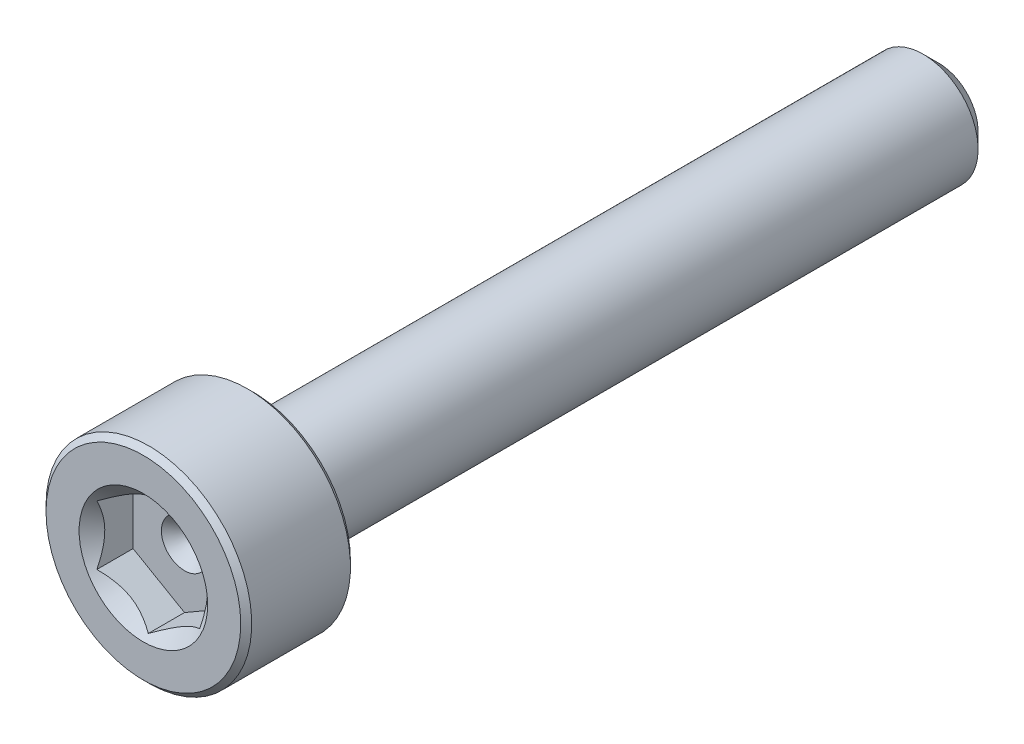
ISO-10303-21;
HEADER;
FILE_DESCRIPTION(('STEP AP214'),'2;1');
FILE_NAME('part.step','',(''),(''),'','','');
FILE_SCHEMA(('AUTOMOTIVE_DESIGN { 1 0 10303 214 1 1 1 1 }'));
ENDSEC;
DATA;
#1=APPLICATION_CONTEXT('core data for automotive mechanical design processes');
#2=APPLICATION_PROTOCOL_DEFINITION('international standard','automotive_design',2000,#1);
#3=PRODUCT_CONTEXT('',#1,'mechanical');
#4=PRODUCT('Part','Part','',(#3));
#5=PRODUCT_RELATED_PRODUCT_CATEGORY('part','',(#4));
#6=PRODUCT_DEFINITION_FORMATION('','',#4);
#7=PRODUCT_DEFINITION_CONTEXT('part definition',#1,'design');
#8=PRODUCT_DEFINITION('design','',#6,#7);
#9=PRODUCT_DEFINITION_SHAPE('','',#8);
#10=(LENGTH_UNIT() NAMED_UNIT(*) SI_UNIT(.MILLI.,.METRE.));
#11=(NAMED_UNIT(*) PLANE_ANGLE_UNIT() SI_UNIT($,.RADIAN.));
#12=(NAMED_UNIT(*) SI_UNIT($,.STERADIAN.) SOLID_ANGLE_UNIT());
#13=UNCERTAINTY_MEASURE_WITH_UNIT(LENGTH_MEASURE(1.E-05),#10,'distance_accuracy_value','');
#14=(GEOMETRIC_REPRESENTATION_CONTEXT(3) GLOBAL_UNCERTAINTY_ASSIGNED_CONTEXT((#13)) GLOBAL_UNIT_ASSIGNED_CONTEXT((#10,
#11,#12)) REPRESENTATION_CONTEXT('',''));
#15=CARTESIAN_POINT('',(0.,0.,0.));
#16=DIRECTION('',(0.,0.,1.));
#17=DIRECTION('',(1.,0.,0.));
#18=AXIS2_PLACEMENT_3D('',#15,#16,#17);
#19=CARTESIAN_POINT('',(0.,0.572668331506588,-5.8));
#20=DIRECTION('',(0.,0.,-1.));
#21=DIRECTION('',(-1.,0.,0.));
#22=AXIS2_PLACEMENT_3D('',#19,#20,#21);
#23=PLANE('',#22);
#24=CARTESIAN_POINT('',(0.,0.,-5.8));
#25=DIRECTION('',(0.,0.,-1.));
#26=DIRECTION('',(-1.,0.,0.));
#27=AXIS2_PLACEMENT_3D('',#24,#25,#26);
#28=CIRCLE('',#27,0.572668331506588);
#29=CARTESIAN_POINT('',(-0.572668331506588,0.,-5.8));
#30=VERTEX_POINT('',#29);
#31=EDGE_CURVE('E54',#30,#30,#28,.T.);
#32=ORIENTED_EDGE('',*,*,#31,.T.);
#33=EDGE_LOOP('',(#32));
#34=FACE_BOUND('',#33,.T.);
#35=ADVANCED_FACE('F41',(#34),#23,.T.);
#36=CARTESIAN_POINT('',(0.,0.,-5.8));
#37=DIRECTION('',(0.,0.,1.));
#38=DIRECTION('',(1.,0.,0.));
#39=AXIS2_PLACEMENT_3D('',#36,#37,#38);
#40=CONICAL_SURFACE('',#39,0.572668331506588,0.785398163397444);
#41=CARTESIAN_POINT('',(0.,0.,-5.57266833150659));
#42=DIRECTION('',(0.,0.,-1.));
#43=DIRECTION('',(-1.,0.,0.));
#44=AXIS2_PLACEMENT_3D('',#41,#42,#43);
#45=CIRCLE('',#44,0.8);
#46=CARTESIAN_POINT('',(-0.8,0.,-5.57266833150659));
#47=VERTEX_POINT('',#46);
#48=EDGE_CURVE('E157',#47,#47,#45,.T.);
#49=ORIENTED_EDGE('',*,*,#48,.T.);
#50=EDGE_LOOP('',(#49));
#51=FACE_BOUND('',#50,.T.);
#52=ORIENTED_EDGE('',*,*,#31,.F.);
#53=EDGE_LOOP('',(#52));
#54=FACE_BOUND('',#53,.T.);
#55=ADVANCED_FACE('F163',(#51,#54),#40,.T.);
#56=CARTESIAN_POINT('',(0.,0.,-5.8));
#57=DIRECTION('',(0.,0.,-1.));
#58=DIRECTION('',(-1.,0.,0.));
#59=AXIS2_PLACEMENT_3D('',#56,#57,#58);
#60=CYLINDRICAL_SURFACE('',#59,0.8);
#61=CARTESIAN_POINT('',(0.,0.,4.));
#62=DIRECTION('',(0.,0.,-1.));
#63=DIRECTION('',(-1.,0.,0.));
#64=AXIS2_PLACEMENT_3D('',#61,#62,#63);
#65=CIRCLE('',#64,0.800000000000001);
#66=CARTESIAN_POINT('',(-0.800000000000001,0.,4.));
#67=VERTEX_POINT('',#66);
#68=EDGE_CURVE('E154',#67,#67,#65,.T.);
#69=ORIENTED_EDGE('',*,*,#68,.T.);
#70=EDGE_LOOP('',(#69));
#71=FACE_BOUND('',#70,.T.);
#72=ORIENTED_EDGE('',*,*,#48,.F.);
#73=EDGE_LOOP('',(#72));
#74=FACE_BOUND('',#73,.T.);
#75=ADVANCED_FACE('F165',(#71,#74),#60,.T.);
#76=CARTESIAN_POINT('',(0.,0.,4.));
#77=DIRECTION('',(0.,0.,-1.));
#78=DIRECTION('',(-1.,0.,0.));
#79=AXIS2_PLACEMENT_3D('',#76,#77,#78);
#80=TOROIDAL_SURFACE('',#79,1.,0.2);
#81=CARTESIAN_POINT('',(0.,0.,4.2));
#82=DIRECTION('',(0.,0.,-1.));
#83=DIRECTION('',(-1.,0.,0.));
#84=AXIS2_PLACEMENT_3D('',#81,#82,#83);
#85=CIRCLE('',#84,1.);
#86=CARTESIAN_POINT('',(-1.,0.,4.2));
#87=VERTEX_POINT('',#86);
#88=EDGE_CURVE('E151',#87,#87,#85,.T.);
#89=ORIENTED_EDGE('',*,*,#88,.T.);
#90=EDGE_LOOP('',(#89));
#91=FACE_BOUND('',#90,.T.);
#92=ORIENTED_EDGE('',*,*,#68,.F.);
#93=EDGE_LOOP('',(#92));
#94=FACE_BOUND('',#93,.T.);
#95=ADVANCED_FACE('F171',(#91,#94),#80,.F.);
#96=CARTESIAN_POINT('',(0.,1.42,4.2));
#97=DIRECTION('',(0.,0.,-1.));
#98=DIRECTION('',(-1.,0.,0.));
#99=AXIS2_PLACEMENT_3D('',#96,#97,#98);
#100=PLANE('',#99);
#101=CARTESIAN_POINT('',(0.,0.,4.2));
#102=DIRECTION('',(0.,0.,-1.));
#103=DIRECTION('',(-1.,0.,0.));
#104=AXIS2_PLACEMENT_3D('',#101,#102,#103);
#105=CIRCLE('',#104,1.42);
#106=CARTESIAN_POINT('',(-1.42,0.,4.2));
#107=VERTEX_POINT('',#106);
#108=EDGE_CURVE('E148',#107,#107,#105,.T.);
#109=ORIENTED_EDGE('',*,*,#108,.T.);
#110=EDGE_LOOP('',(#109));
#111=FACE_BOUND('',#110,.T.);
#112=ORIENTED_EDGE('',*,*,#88,.F.);
#113=EDGE_LOOP('',(#112));
#114=FACE_BOUND('',#113,.T.);
#115=ADVANCED_FACE('F177',(#111,#114),#100,.T.);
#116=CARTESIAN_POINT('',(0.,0.,4.2));
#117=DIRECTION('',(0.,0.,1.));
#118=DIRECTION('',(1.,0.,0.));
#119=AXIS2_PLACEMENT_3D('',#116,#117,#118);
#120=CONICAL_SURFACE('',#119,1.42,0.785398163397447);
#121=CARTESIAN_POINT('',(0.,0.,4.28));
#122=DIRECTION('',(0.,0.,-1.));
#123=DIRECTION('',(-1.,0.,0.));
#124=AXIS2_PLACEMENT_3D('',#121,#122,#123);
#125=CIRCLE('',#124,1.5);
#126=CARTESIAN_POINT('',(-1.5,0.,4.28));
#127=VERTEX_POINT('',#126);
#128=EDGE_CURVE('E145',#127,#127,#125,.T.);
#129=ORIENTED_EDGE('',*,*,#128,.T.);
#130=EDGE_LOOP('',(#129));
#131=FACE_BOUND('',#130,.T.);
#132=ORIENTED_EDGE('',*,*,#108,.F.);
#133=EDGE_LOOP('',(#132));
#134=FACE_BOUND('',#133,.T.);
#135=ADVANCED_FACE('F181',(#131,#134),#120,.T.);
#136=CARTESIAN_POINT('',(0.,0.,-5.8));
#137=DIRECTION('',(0.,0.,-1.));
#138=DIRECTION('',(-1.,0.,0.));
#139=AXIS2_PLACEMENT_3D('',#136,#137,#138);
#140=CYLINDRICAL_SURFACE('',#139,1.5);
#141=CARTESIAN_POINT('',(0.,0.,5.72));
#142=DIRECTION('',(0.,0.,-1.));
#143=DIRECTION('',(-1.,0.,0.));
#144=AXIS2_PLACEMENT_3D('',#141,#142,#143);
#145=CIRCLE('',#144,1.5);
#146=CARTESIAN_POINT('',(-1.5,0.,5.72));
#147=VERTEX_POINT('',#146);
#148=EDGE_CURVE('E142',#147,#147,#145,.T.);
#149=ORIENTED_EDGE('',*,*,#148,.T.);
#150=EDGE_LOOP('',(#149));
#151=FACE_BOUND('',#150,.T.);
#152=ORIENTED_EDGE('',*,*,#128,.F.);
#153=EDGE_LOOP('',(#152));
#154=FACE_BOUND('',#153,.T.);
#155=ADVANCED_FACE('F185',(#151,#154),#140,.T.);
#156=CARTESIAN_POINT('',(0.,0.,5.72));
#157=DIRECTION('',(0.,0.,-1.));
#158=DIRECTION('',(-1.,0.,0.));
#159=AXIS2_PLACEMENT_3D('',#156,#157,#158);
#160=CONICAL_SURFACE('',#159,1.5,0.785398163397447);
#161=CARTESIAN_POINT('',(0.,0.,5.8));
#162=DIRECTION('',(0.,0.,-1.));
#163=DIRECTION('',(-1.,0.,0.));
#164=AXIS2_PLACEMENT_3D('',#161,#162,#163);
#165=CIRCLE('',#164,1.42);
#166=CARTESIAN_POINT('',(-1.42,0.,5.8));
#167=VERTEX_POINT('',#166);
#168=EDGE_CURVE('E139',#167,#167,#165,.T.);
#169=ORIENTED_EDGE('',*,*,#168,.T.);
#170=EDGE_LOOP('',(#169));
#171=FACE_BOUND('',#170,.T.);
#172=ORIENTED_EDGE('',*,*,#148,.F.);
#173=EDGE_LOOP('',(#172));
#174=FACE_BOUND('',#173,.T.);
#175=ADVANCED_FACE('F189',(#171,#174),#160,.T.);
#176=CARTESIAN_POINT('',(0.,0.,5.8));
#177=DIRECTION('',(0.,0.,1.));
#178=DIRECTION('',(1.,0.,0.));
#179=AXIS2_PLACEMENT_3D('',#176,#177,#178);
#180=PLANE('',#179);
#181=CARTESIAN_POINT('',(0.,0.,5.8));
#182=DIRECTION('',(0.,0.,1.));
#183=DIRECTION('',(1.,0.,0.));
#184=AXIS2_PLACEMENT_3D('',#181,#182,#183);
#185=CIRCLE('',#184,0.9375);
#186=CARTESIAN_POINT('',(0.9375,0.,5.8));
#187=VERTEX_POINT('',#186);
#188=EDGE_CURVE('E275',#187,#187,#185,.T.);
#189=ORIENTED_EDGE('',*,*,#188,.F.);
#190=EDGE_LOOP('',(#189));
#191=FACE_BOUND('',#190,.T.);
#192=ORIENTED_EDGE('',*,*,#168,.F.);
#193=EDGE_LOOP('',(#192));
#194=FACE_BOUND('',#193,.T.);
#195=ADVANCED_FACE('F193',(#191,#194),#180,.T.);
#196=CARTESIAN_POINT('',(0.,0.,5.8));
#197=DIRECTION('',(0.,0.,1.));
#198=DIRECTION('',(1.,0.,0.));
#199=AXIS2_PLACEMENT_3D('',#196,#197,#198);
#200=CONICAL_SURFACE('',#199,0.9375,0.78539816339745);
#201=ORIENTED_EDGE('',*,*,#188,.T.);
#202=EDGE_LOOP('',(#201));
#203=FACE_BOUND('',#202,.T.);
#204=CARTESIAN_POINT('',(-0.000199999999999958,-0.866140873838277,5.72864089692921));
#205=CARTESIAN_POINT('',(0.0255899625576815,-0.851251032013209,5.71375951424836));
#206=CARTESIAN_POINT('',(0.0518112021286591,-0.836112192288419,5.6997516693914));
#207=CARTESIAN_POINT('',(0.105279708235706,-0.805242135894349,5.6741029284667));
#208=CARTESIAN_POINT('',(0.132532067460573,-0.78950797895982,5.66247631549011));
#209=CARTESIAN_POINT('',(0.187485350381353,-0.757780686272653,5.64255944955668));
#210=CARTESIAN_POINT('',(0.215172256695509,-0.741795643459147,5.63421909786581));
#211=CARTESIAN_POINT('',(0.271155595130853,-0.709473647943368,5.62136814574587));
#212=CARTESIAN_POINT('',(0.299450314843645,-0.693137683900542,5.61684794437328));
#213=CARTESIAN_POINT('',(0.348210289268843,-0.664986099540475,5.61277123688188));
#214=CARTESIAN_POINT('',(0.368612065655572,-0.65320712845165,5.61216820039852));
#215=CARTESIAN_POINT('',(0.40937613469636,-0.629671982217687,5.61317990979997));
#216=CARTESIAN_POINT('',(0.429738417651455,-0.617915812672248,5.61479514477447));
#217=CARTESIAN_POINT('',(0.490534543086823,-0.582815153286451,5.62286155075748));
#218=CARTESIAN_POINT('',(0.530665854996099,-0.559645329552698,5.63253433961216));
#219=CARTESIAN_POINT('',(0.601110400354025,-0.518974152327359,5.65588172175675));
#220=CARTESIAN_POINT('',(0.631753572009086,-0.501282308923485,5.66833396185669));
#221=CARTESIAN_POINT('',(0.69183934580479,-0.466591771248069,5.6963850140153));
#222=CARTESIAN_POINT('',(0.721285488381591,-0.449591032904757,5.71197358968819));
#223=CARTESIAN_POINT('',(0.7502,-0.432897231838382,5.72864089692921));
#224=B_SPLINE_CURVE_WITH_KNOTS('',3,(#204,#205,#206,#207,#208,#209,#210,#211,#212,#213,#214,
#215,#216,#217,#218,#219,#220,#221,#222,#223),.UNSPECIFIED.,.F.,.F.,(4,2,2,2,2,2,2,2,2,4),(0.,
0.0999419466095594,0.200466857654446,0.299393763705717,0.39807129730023,0.468665775681747,
0.539275821398839,0.680536257244566,0.792918418368073,0.904939568716032),.UNSPECIFIED.);
#225=CARTESIAN_POINT('',(0.,-0.866025403784439,5.72852540378444));
#226=VERTEX_POINT('',#225);
#227=CARTESIAN_POINT('',(0.75,-0.43301270189222,5.72852540378444));
#228=VERTEX_POINT('',#227);
#229=EDGE_CURVE('E12',#226,#228,#224,.T.);
#230=ORIENTED_EDGE('',*,*,#229,.F.);
#231=CARTESIAN_POINT('',(-0.7502,-0.432897231838382,5.72864089692921));
#232=CARTESIAN_POINT('',(-0.724410037442318,-0.447787073663449,5.71375951424836));
#233=CARTESIAN_POINT('',(-0.698188797871341,-0.462925913388239,5.6997516693914));
#234=CARTESIAN_POINT('',(-0.644720291764294,-0.49379596978231,5.6741029284667));
#235=CARTESIAN_POINT('',(-0.617467932539427,-0.509530126716839,5.66247631549011));
#236=CARTESIAN_POINT('',(-0.562514649618647,-0.541257419404005,5.64255944955668));
#237=CARTESIAN_POINT('',(-0.534827743304491,-0.557242462217511,5.63421909786581));
#238=CARTESIAN_POINT('',(-0.478844404869147,-0.589564457733291,5.62136814574586));
#239=CARTESIAN_POINT('',(-0.450549685156355,-0.605900421776116,5.61684794437328));
#240=CARTESIAN_POINT('',(-0.401789710731157,-0.634052006136184,5.61277123688188));
#241=CARTESIAN_POINT('',(-0.381387934344427,-0.645830977225008,5.61216820039852));
#242=CARTESIAN_POINT('',(-0.34062386530364,-0.669366123458972,5.61317990979997));
#243=CARTESIAN_POINT('',(-0.320261582348545,-0.681122293004411,5.61479514477447));
#244=CARTESIAN_POINT('',(-0.259465456913176,-0.716222952390207,5.62286155075748));
#245=CARTESIAN_POINT('',(-0.219334145003901,-0.73939277612396,5.63253433961216));
#246=CARTESIAN_POINT('',(-0.148889599645974,-0.7800639533493,5.65588172175675));
#247=CARTESIAN_POINT('',(-0.118246427990914,-0.797755796753173,5.66833396185669));
#248=CARTESIAN_POINT('',(-0.0581606541952103,-0.832446334428589,5.6963850140153));
#249=CARTESIAN_POINT('',(-0.0287145116184094,-0.849447072771901,5.71197358968819));
#250=CARTESIAN_POINT('',(0.000199999999999851,-0.866140873838277,5.72864089692921));
#251=B_SPLINE_CURVE_WITH_KNOTS('',3,(#231,#232,#233,#234,#235,#236,#237,#238,#239,#240,#241,
#242,#243,#244,#245,#246,#247,#248,#249,#250),.UNSPECIFIED.,.F.,.F.,(4,2,2,2,2,2,2,2,2,4),(0.,
0.0999419466095592,0.200466857654446,0.299393763705717,0.39807129730023,0.468665775681747,
0.539275821398839,0.680536257244566,0.792918418368073,0.904939568716031),.UNSPECIFIED.);
#252=CARTESIAN_POINT('',(-0.749999999999999,-0.43301270189222,5.72852540378444));
#253=VERTEX_POINT('',#252);
#254=EDGE_CURVE('E99',#253,#226,#251,.T.);
#255=ORIENTED_EDGE('',*,*,#254,.F.);
#256=CARTESIAN_POINT('',(-0.749999999999999,-0.887185653712608,6.02422216306373));
#257=CARTESIAN_POINT('',(-0.749999999999999,-0.865686303867291,6.00780595331894));
#258=CARTESIAN_POINT('',(-0.749999999999999,-0.844069736276995,5.99154369069973));
#259=CARTESIAN_POINT('',(-0.749999999999999,-0.800553829063334,5.95939131976381));
#260=CARTESIAN_POINT('',(-0.749999999999999,-0.77865442268507,5.94350130188877));
#261=CARTESIAN_POINT('',(-0.749999999999999,-0.71213880076248,5.8962590361517));
#262=CARTESIAN_POINT('',(-0.75,-0.667031556107127,5.86558694829063));
#263=CARTESIAN_POINT('',(-0.75,-0.572287252432352,5.80515346190982));
#264=CARTESIAN_POINT('',(-0.75,-0.522541479206488,5.77556058946619));
#265=CARTESIAN_POINT('',(-0.75,-0.420539159676037,5.72127492073485));
#266=CARTESIAN_POINT('',(-0.75,-0.368291861400195,5.69656558167692));
#267=CARTESIAN_POINT('',(-0.75,-0.290082111843122,5.66633213591508));
#268=CARTESIAN_POINT('',(-0.75,-0.265332456621095,5.65769624595078));
#269=CARTESIAN_POINT('',(-0.75,-0.215228927837108,5.64240351060242));
#270=CARTESIAN_POINT('',(-0.75,-0.189875014697201,5.63574679523811));
#271=CARTESIAN_POINT('',(-0.75,-0.113992737161871,5.61954263822687));
#272=CARTESIAN_POINT('',(-0.75,-0.06266470671956,5.61335561860786));
#273=CARTESIAN_POINT('',(-0.75,0.0380766851633827,5.61184444334974));
#274=CARTESIAN_POINT('',(-0.75,0.0874833972685407,5.61609047783741));
#275=CARTESIAN_POINT('',(-0.75,0.160744205076438,5.62913770913913));
#276=CARTESIAN_POINT('',(-0.75,0.185245938960752,5.63468336898571));
#277=CARTESIAN_POINT('',(-0.75,0.23372212618524,5.64772930551788));
#278=CARTESIAN_POINT('',(-0.75,0.257696615275428,5.65522944923316));
#279=CARTESIAN_POINT('',(-0.75,0.332134518725693,5.68136874934752));
#280=CARTESIAN_POINT('',(-0.75,0.381561260546401,5.70294292451713));
#281=CARTESIAN_POINT('',(-0.75,0.478103817249653,5.75093648122911));
#282=CARTESIAN_POINT('',(-0.75,0.525210650736254,5.77737306369587));
#283=CARTESIAN_POINT('',(-0.75,0.615251489327311,5.83194380742878));
#284=CARTESIAN_POINT('',(-0.75,0.658276660551496,5.85992946877431));
#285=CARTESIAN_POINT('',(-0.75,0.721665395730771,5.90320510156133));
#286=CARTESIAN_POINT('',(-0.75,0.742521972755764,5.9177853781128));
#287=CARTESIAN_POINT('',(-0.75,0.783949417853699,5.9473349235198));
#288=CARTESIAN_POINT('',(-0.75,0.804520362631015,5.96230408471715));
#289=CARTESIAN_POINT('',(-0.75,0.824972224375268,5.97743460390764));
#290=B_SPLINE_CURVE_WITH_KNOTS('',3,(#256,#257,#258,#259,#260,#261,#262,#263,#264,#265,#266,
#267,#268,#269,#270,#271,#272,#273,#274,#275,#276,#277,#278,#279,#280,#281,#282,#283,#284,#285,
#286,#287,#288,#289),.UNSPECIFIED.,.F.,.F.,(4,2,2,2,2,2,2,2,2,2,2,2,2,2,2,2,4),(0.,
0.0811486778560397,0.162316871532108,0.325890253342798,0.499400874757972,0.672313263750185,
0.750879778795919,0.829451454044745,0.983457421941731,1.13122596768799,1.20651954305626,
1.2818079972785,1.44313005698569,1.60503417580591,1.7589355452722,1.83527541777334,
1.91159437706),.UNSPECIFIED.);
#291=CARTESIAN_POINT('',(-0.75,0.43301270189222,5.72852540378444));
#292=VERTEX_POINT('',#291);
#293=EDGE_CURVE('E112',#292,#253,#290,.F.);
#294=ORIENTED_EDGE('',*,*,#293,.F.);
#295=CARTESIAN_POINT('',(0.000200000000000048,0.866140873838277,5.72864089692921));
#296=CARTESIAN_POINT('',(-0.0255899625576815,0.851251032013209,5.71375951424836));
#297=CARTESIAN_POINT('',(-0.0518112021286592,0.836112192288419,5.6997516693914));
#298=CARTESIAN_POINT('',(-0.105279708235706,0.805242135894348,5.6741029284667));
#299=CARTESIAN_POINT('',(-0.132532067460573,0.789507978959819,5.66247631549011));
#300=CARTESIAN_POINT('',(-0.187485350381353,0.757780686272653,5.64255944955668));
#301=CARTESIAN_POINT('',(-0.21517225669551,0.741795643459147,5.63421909786581));
#302=CARTESIAN_POINT('',(-0.271155595130853,0.709473647943367,5.62136814574587));
#303=CARTESIAN_POINT('',(-0.299450314843645,0.693137683900542,5.61684794437328));
#304=CARTESIAN_POINT('',(-0.348210289268843,0.664986099540475,5.61277123688188));
#305=CARTESIAN_POINT('',(-0.368612065655573,0.65320712845165,5.61216820039852));
#306=CARTESIAN_POINT('',(-0.40937613469636,0.629671982217687,5.61317990979997));
#307=CARTESIAN_POINT('',(-0.429738417651455,0.617915812672247,5.61479514477447));
#308=CARTESIAN_POINT('',(-0.490534543086824,0.582815153286451,5.62286155075748));
#309=CARTESIAN_POINT('',(-0.530665854996099,0.559645329552698,5.63253433961216));
#310=CARTESIAN_POINT('',(-0.601110400354026,0.518974152327358,5.65588172175675));
#311=CARTESIAN_POINT('',(-0.631753572009087,0.501282308923485,5.66833396185669));
#312=CARTESIAN_POINT('',(-0.69183934580479,0.466591771248069,5.6963850140153));
#313=CARTESIAN_POINT('',(-0.721285488381591,0.449591032904757,5.71197358968819));
#314=CARTESIAN_POINT('',(-0.7502,0.432897231838382,5.72864089692921));
#315=B_SPLINE_CURVE_WITH_KNOTS('',3,(#295,#296,#297,#298,#299,#300,#301,#302,#303,#304,#305,
#306,#307,#308,#309,#310,#311,#312,#313,#314),.UNSPECIFIED.,.F.,.F.,(4,2,2,2,2,2,2,2,2,4),(0.,
0.0999419466095596,0.200466857654446,0.299393763705718,0.39807129730023,0.468665775681748,
0.539275821398839,0.680536257244566,0.792918418368074,0.904939568716031),.UNSPECIFIED.);
#316=CARTESIAN_POINT('',(0.,0.866025403784439,5.72852540378444));
#317=VERTEX_POINT('',#316);
#318=EDGE_CURVE('E248',#317,#292,#315,.T.);
#319=ORIENTED_EDGE('',*,*,#318,.F.);
#320=CARTESIAN_POINT('',(0.7502,0.432897231838382,5.72864089692921));
#321=CARTESIAN_POINT('',(0.724410037442318,0.44778707366345,5.71375951424836));
#322=CARTESIAN_POINT('',(0.698188797871341,0.462925913388239,5.6997516693914));
#323=CARTESIAN_POINT('',(0.644720291764293,0.49379596978231,5.6741029284667));
#324=CARTESIAN_POINT('',(0.617467932539427,0.509530126716839,5.66247631549011));
#325=CARTESIAN_POINT('',(0.562514649618647,0.541257419404005,5.64255944955668));
#326=CARTESIAN_POINT('',(0.53482774330449,0.557242462217512,5.63421909786581));
#327=CARTESIAN_POINT('',(0.478844404869147,0.589564457733291,5.62136814574587));
#328=CARTESIAN_POINT('',(0.450549685156355,0.605900421776116,5.61684794437328));
#329=CARTESIAN_POINT('',(0.401789710731157,0.634052006136184,5.61277123688188));
#330=CARTESIAN_POINT('',(0.381387934344427,0.645830977225008,5.61216820039852));
#331=CARTESIAN_POINT('',(0.34062386530364,0.669366123458972,5.61317990979997));
#332=CARTESIAN_POINT('',(0.320261582348545,0.681122293004411,5.61479514477447));
#333=CARTESIAN_POINT('',(0.259465456913176,0.716222952390208,5.62286155075748));
#334=CARTESIAN_POINT('',(0.219334145003901,0.73939277612396,5.63253433961216));
#335=CARTESIAN_POINT('',(0.148889599645974,0.7800639533493,5.65588172175675));
#336=CARTESIAN_POINT('',(0.118246427990914,0.797755796753173,5.66833396185669));
#337=CARTESIAN_POINT('',(0.0581606541952105,0.832446334428589,5.6963850140153));
#338=CARTESIAN_POINT('',(0.0287145116184095,0.849447072771901,5.71197358968819));
#339=CARTESIAN_POINT('',(-0.000199999999999758,0.866140873838277,5.72864089692921));
#340=B_SPLINE_CURVE_WITH_KNOTS('',3,(#320,#321,#322,#323,#324,#325,#326,#327,#328,#329,#330,
#331,#332,#333,#334,#335,#336,#337,#338,#339),.UNSPECIFIED.,.F.,.F.,(4,2,2,2,2,2,2,2,2,4),(0.,
0.0999419466095596,0.200466857654446,0.299393763705717,0.39807129730023,0.468665775681748,
0.539275821398839,0.680536257244566,0.792918418368073,0.904939568716031),.UNSPECIFIED.);
#341=CARTESIAN_POINT('',(0.75,0.43301270189222,5.72852540378444));
#342=VERTEX_POINT('',#341);
#343=EDGE_CURVE('E218',#342,#317,#340,.T.);
#344=ORIENTED_EDGE('',*,*,#343,.F.);
#345=CARTESIAN_POINT('',(0.75,-0.887185653721339,6.0242221630704));
#346=CARTESIAN_POINT('',(0.75,-0.865686303875773,6.00780595332535));
#347=CARTESIAN_POINT('',(0.75,-0.844069736285226,5.99154369070589));
#348=CARTESIAN_POINT('',(0.75,-0.800553829071063,5.95939131976945));
#349=CARTESIAN_POINT('',(0.75,-0.778654422692546,5.94350130189415));
#350=CARTESIAN_POINT('',(0.75,-0.712138800769183,5.89625903615631));
#351=CARTESIAN_POINT('',(0.75,-0.667031556113305,5.86558694829472));
#352=CARTESIAN_POINT('',(0.75,-0.572287252437385,5.80515346191286));
#353=CARTESIAN_POINT('',(0.75,-0.522541479210898,5.7755605894687));
#354=CARTESIAN_POINT('',(0.75,-0.420539159679147,5.72127492073635));
#355=CARTESIAN_POINT('',(0.75,-0.368291861402629,5.69656558167796));
#356=CARTESIAN_POINT('',(0.75,-0.29008211184505,5.66633213591578));
#357=CARTESIAN_POINT('',(0.75,-0.26533245662324,5.65769624595151));
#358=CARTESIAN_POINT('',(0.75,-0.215228927839692,5.64240351060314));
#359=CARTESIAN_POINT('',(0.75,-0.189875014700009,5.63574679523881));
#360=CARTESIAN_POINT('',(0.75,-0.113992737165335,5.61954263822742));
#361=CARTESIAN_POINT('',(0.75,-0.0626647067234624,5.61335561860821));
#362=CARTESIAN_POINT('',(0.75,0.0380766851587392,5.61184444334952));
#363=CARTESIAN_POINT('',(0.75,0.0874833972635919,5.61609047783685));
#364=CARTESIAN_POINT('',(0.75,0.160744205071071,5.62913770913801));
#365=CARTESIAN_POINT('',(0.75,0.185245938955246,5.6346833689844));
#366=CARTESIAN_POINT('',(0.75,0.233722126179471,5.64772930551617));
#367=CARTESIAN_POINT('',(0.75,0.257696615269533,5.65522944923125));
#368=CARTESIAN_POINT('',(0.75,0.332134518718534,5.68136874934467));
#369=CARTESIAN_POINT('',(0.75,0.381561260538165,5.70294292451342));
#370=CARTESIAN_POINT('',(0.75,0.478103817239346,5.7509364812236));
#371=CARTESIAN_POINT('',(0.75,0.525210650724953,5.7773730636894));
#372=CARTESIAN_POINT('',(0.75,0.615251489314227,5.83194380742049));
#373=CARTESIAN_POINT('',(0.75,0.658276660537614,5.85992946876516));
#374=CARTESIAN_POINT('',(0.75,0.72166539571571,5.90320510155089));
#375=CARTESIAN_POINT('',(0.75,0.742521972740316,5.91778537810193));
#376=CARTESIAN_POINT('',(0.75,0.783949417837479,5.94733492350808));
#377=CARTESIAN_POINT('',(0.75,0.80452036261441,5.96230408470501));
#378=CARTESIAN_POINT('',(0.75,0.82497222435828,5.97743460389507));
#379=B_SPLINE_CURVE_WITH_KNOTS('',3,(#345,#346,#347,#348,#349,#350,#351,#352,#353,#354,#355,
#356,#357,#358,#359,#360,#361,#362,#363,#364,#365,#366,#367,#368,#369,#370,#371,#372,#373,#374,
#375,#376,#377,#378),.UNSPECIFIED.,.F.,.F.,(4,2,2,2,2,2,2,2,2,2,2,2,2,2,2,2,4),(0.,
0.0811486778571032,0.162316871534236,0.325890253347093,0.4994008747647,0.672313263759325,
0.750879778804429,0.829451454052625,0.983457421948412,1.13122596769368,1.20651954306142,
1.28180799728312,1.44313005698634,1.60503417580256,1.75893554526544,1.83527541776489,
1.91159437704986),.UNSPECIFIED.);
#380=EDGE_CURVE('E61',#228,#342,#379,.T.);
#381=ORIENTED_EDGE('',*,*,#380,.F.);
#382=EDGE_LOOP('',(#230,#255,#294,#319,#344,#381));
#383=FACE_BOUND('',#382,.T.);
#384=ADVANCED_FACE('F98',(#203,#383),#200,.F.);
#385=CARTESIAN_POINT('',(0.,-0.866025403784439,1.90871215252208));
#386=DIRECTION('',(0.5,-0.866025403784439,0.));
#387=DIRECTION('',(0.866025403784439,0.5,0.));
#388=AXIS2_PLACEMENT_3D('',#385,#386,#387);
#389=PLANE('',#388);
#390=DIRECTION('',(0.,0.,1.));
#391=VECTOR('',#390,1.);
#392=CARTESIAN_POINT('',(0.,-0.866025403784439,1.90871215252208));
#393=LINE('',#392,#391);
#394=CARTESIAN_POINT('',(0.,-0.866025403784439,5.2));
#395=VERTEX_POINT('',#394);
#396=EDGE_CURVE('E108',#395,#226,#393,.T.);
#397=ORIENTED_EDGE('',*,*,#396,.T.);
#398=ORIENTED_EDGE('',*,*,#229,.T.);
#399=DIRECTION('',(0.,0.,1.));
#400=VECTOR('',#399,1.);
#401=CARTESIAN_POINT('',(0.75,-0.43301270189222,1.90871215252208));
#402=LINE('',#401,#400);
#403=CARTESIAN_POINT('',(0.75,-0.43301270189222,5.2));
#404=VERTEX_POINT('',#403);
#405=EDGE_CURVE('E119',#404,#228,#402,.T.);
#406=ORIENTED_EDGE('',*,*,#405,.F.);
#407=DIRECTION('',(0.866025403784439,0.5,0.));
#408=VECTOR('',#407,1.);
#409=CARTESIAN_POINT('',(0.,-0.866025403784439,5.2));
#410=LINE('',#409,#408);
#411=EDGE_CURVE('E116',#395,#404,#410,.T.);
#412=ORIENTED_EDGE('',*,*,#411,.F.);
#413=EDGE_LOOP('',(#397,#398,#406,#412));
#414=FACE_BOUND('',#413,.T.);
#415=ADVANCED_FACE('F115',(#414),#389,.F.);
#416=CARTESIAN_POINT('',(-0.75,-0.43301270189222,1.90871215252208));
#417=DIRECTION('',(-0.5,-0.866025403784439,0.));
#418=DIRECTION('',(0.866025403784439,-0.5,0.));
#419=AXIS2_PLACEMENT_3D('',#416,#417,#418);
#420=PLANE('',#419);
#421=DIRECTION('',(0.,0.,1.));
#422=VECTOR('',#421,1.);
#423=CARTESIAN_POINT('',(-0.75,-0.43301270189222,1.90871215252208));
#424=LINE('',#423,#422);
#425=CARTESIAN_POINT('',(-0.75,-0.43301270189222,5.2));
#426=VERTEX_POINT('',#425);
#427=EDGE_CURVE('E111',#426,#253,#424,.T.);
#428=ORIENTED_EDGE('',*,*,#427,.T.);
#429=ORIENTED_EDGE('',*,*,#254,.T.);
#430=ORIENTED_EDGE('',*,*,#396,.F.);
#431=DIRECTION('',(0.866025403784439,-0.5,0.));
#432=VECTOR('',#431,1.);
#433=CARTESIAN_POINT('',(-0.75,-0.43301270189222,5.2));
#434=LINE('',#433,#432);
#435=EDGE_CURVE('E117',#426,#395,#434,.T.);
#436=ORIENTED_EDGE('',*,*,#435,.F.);
#437=EDGE_LOOP('',(#428,#429,#430,#436));
#438=FACE_BOUND('',#437,.T.);
#439=ADVANCED_FACE('F107',(#438),#420,.F.);
#440=CARTESIAN_POINT('',(-0.75,0.43301270189222,1.90871215252208));
#441=DIRECTION('',(-1.,0.,0.));
#442=DIRECTION('',(0.,-1.,0.));
#443=AXIS2_PLACEMENT_3D('',#440,#441,#442);
#444=PLANE('',#443);
#445=DIRECTION('',(0.,0.,1.));
#446=VECTOR('',#445,1.);
#447=CARTESIAN_POINT('',(-0.75,0.43301270189222,1.90871215252208));
#448=LINE('',#447,#446);
#449=CARTESIAN_POINT('',(-0.75,0.43301270189222,5.2));
#450=VERTEX_POINT('',#449);
#451=EDGE_CURVE('E128',#450,#292,#448,.T.);
#452=ORIENTED_EDGE('',*,*,#451,.T.);
#453=ORIENTED_EDGE('',*,*,#293,.T.);
#454=ORIENTED_EDGE('',*,*,#427,.F.);
#455=DIRECTION('',(0.,-1.,0.));
#456=VECTOR('',#455,1.);
#457=CARTESIAN_POINT('',(-0.75,0.43301270189222,5.2));
#458=LINE('',#457,#456);
#459=EDGE_CURVE('E127',#450,#426,#458,.T.);
#460=ORIENTED_EDGE('',*,*,#459,.F.);
#461=EDGE_LOOP('',(#452,#453,#454,#460));
#462=FACE_BOUND('',#461,.T.);
#463=ADVANCED_FACE('F257',(#462),#444,.F.);
#464=CARTESIAN_POINT('',(0.,0.866025403784439,1.90871215252208));
#465=DIRECTION('',(-0.5,0.866025403784439,0.));
#466=DIRECTION('',(-0.866025403784439,-0.5,0.));
#467=AXIS2_PLACEMENT_3D('',#464,#465,#466);
#468=PLANE('',#467);
#469=DIRECTION('',(0.,0.,1.));
#470=VECTOR('',#469,1.);
#471=CARTESIAN_POINT('',(0.,0.866025403784439,1.90871215252208));
#472=LINE('',#471,#470);
#473=CARTESIAN_POINT('',(0.,0.866025403784439,5.2));
#474=VERTEX_POINT('',#473);
#475=EDGE_CURVE('E132',#474,#317,#472,.T.);
#476=ORIENTED_EDGE('',*,*,#475,.T.);
#477=ORIENTED_EDGE('',*,*,#318,.T.);
#478=ORIENTED_EDGE('',*,*,#451,.F.);
#479=DIRECTION('',(-0.866025403784439,-0.5,0.));
#480=VECTOR('',#479,1.);
#481=CARTESIAN_POINT('',(0.,0.866025403784439,5.2));
#482=LINE('',#481,#480);
#483=EDGE_CURVE('E131',#474,#450,#482,.T.);
#484=ORIENTED_EDGE('',*,*,#483,.F.);
#485=EDGE_LOOP('',(#476,#477,#478,#484));
#486=FACE_BOUND('',#485,.T.);
#487=ADVANCED_FACE('F254',(#486),#468,.F.);
#488=CARTESIAN_POINT('',(0.75,0.43301270189222,1.90871215252208));
#489=DIRECTION('',(0.5,0.866025403784439,0.));
#490=DIRECTION('',(-0.866025403784439,0.5,0.));
#491=AXIS2_PLACEMENT_3D('',#488,#489,#490);
#492=PLANE('',#491);
#493=DIRECTION('',(0.,0.,1.));
#494=VECTOR('',#493,1.);
#495=CARTESIAN_POINT('',(0.75,0.43301270189222,1.90871215252208));
#496=LINE('',#495,#494);
#497=CARTESIAN_POINT('',(0.75,0.43301270189222,5.2));
#498=VERTEX_POINT('',#497);
#499=EDGE_CURVE('E135',#498,#342,#496,.T.);
#500=ORIENTED_EDGE('',*,*,#499,.T.);
#501=ORIENTED_EDGE('',*,*,#343,.T.);
#502=ORIENTED_EDGE('',*,*,#475,.F.);
#503=DIRECTION('',(-0.866025403784439,0.5,0.));
#504=VECTOR('',#503,1.);
#505=CARTESIAN_POINT('',(0.75,0.43301270189222,5.2));
#506=LINE('',#505,#504);
#507=EDGE_CURVE('E124',#498,#474,#506,.T.);
#508=ORIENTED_EDGE('',*,*,#507,.F.);
#509=EDGE_LOOP('',(#500,#501,#502,#508));
#510=FACE_BOUND('',#509,.T.);
#511=ADVANCED_FACE('F207',(#510),#492,.F.);
#512=CARTESIAN_POINT('',(0.75,-0.43301270189222,1.90871215252208));
#513=DIRECTION('',(1.,0.,0.));
#514=DIRECTION('',(0.,1.,0.));
#515=AXIS2_PLACEMENT_3D('',#512,#513,#514);
#516=PLANE('',#515);
#517=ORIENTED_EDGE('',*,*,#405,.T.);
#518=ORIENTED_EDGE('',*,*,#380,.T.);
#519=ORIENTED_EDGE('',*,*,#499,.F.);
#520=DIRECTION('',(0.,1.,0.));
#521=VECTOR('',#520,1.);
#522=CARTESIAN_POINT('',(0.75,-0.43301270189222,5.2));
#523=LINE('',#522,#521);
#524=EDGE_CURVE('E68',#404,#498,#523,.T.);
#525=ORIENTED_EDGE('',*,*,#524,.F.);
#526=EDGE_LOOP('',(#517,#518,#519,#525));
#527=FACE_BOUND('',#526,.T.);
#528=ADVANCED_FACE('F202',(#527),#516,.F.);
#529=CARTESIAN_POINT('',(0.,1.42,5.2));
#530=DIRECTION('',(0.,0.,-1.));
#531=DIRECTION('',(-1.,0.,0.));
#532=AXIS2_PLACEMENT_3D('',#529,#530,#531);
#533=PLANE('',#532);
#534=CARTESIAN_POINT('',(0.,0.,5.2));
#535=DIRECTION('',(0.,0.,-1.));
#536=DIRECTION('',(-1.,0.,0.));
#537=AXIS2_PLACEMENT_3D('',#534,#535,#536);
#538=CIRCLE('',#537,0.337499999999998);
#539=CARTESIAN_POINT('',(-0.337499999999998,0.,5.2));
#540=VERTEX_POINT('',#539);
#541=EDGE_CURVE('E217',#540,#540,#538,.T.);
#542=ORIENTED_EDGE('',*,*,#541,.T.);
#543=EDGE_LOOP('',(#542));
#544=FACE_BOUND('',#543,.T.);
#545=ORIENTED_EDGE('',*,*,#411,.T.);
#546=ORIENTED_EDGE('',*,*,#524,.T.);
#547=ORIENTED_EDGE('',*,*,#507,.T.);
#548=ORIENTED_EDGE('',*,*,#483,.T.);
#549=ORIENTED_EDGE('',*,*,#459,.T.);
#550=ORIENTED_EDGE('',*,*,#435,.T.);
#551=EDGE_LOOP('',(#545,#546,#547,#548,#549,#550));
#552=FACE_BOUND('',#551,.T.);
#553=ADVANCED_FACE('F198',(#544,#552),#533,.F.);
#554=CARTESIAN_POINT('',(0.,0.,5.));
#555=DIRECTION('',(0.,0.,1.));
#556=DIRECTION('',(1.,0.,0.));
#557=AXIS2_PLACEMENT_3D('',#554,#555,#556);
#558=CIRCLE('',#557,0.137499999999998);
#559=CARTESIAN_POINT('',(0.137499999999998,0.,5.));
#560=VERTEX_POINT('',#559);
#561=EDGE_CURVE('E113',#560,#560,#558,.T.);
#562=ORIENTED_EDGE('',*,*,#561,.F.);
#563=EDGE_LOOP('',(#562));
#564=FACE_BOUND('',#563,.T.);
#565=ORIENTED_EDGE('',*,*,#541,.F.);
#566=EDGE_LOOP('',(#565));
#567=FACE_BOUND('',#566,.T.);
#568=ADVANCED_FACE('F201',(#564,#567),#200,.F.);
#569=CARTESIAN_POINT('',(0.,0.,5.));
#570=DIRECTION('',(0.,0.,1.));
#571=DIRECTION('',(1.,0.,0.));
#572=AXIS2_PLACEMENT_3D('',#569,#570,#571);
#573=PLANE('',#572);
#574=ORIENTED_EDGE('',*,*,#561,.T.);
#575=EDGE_LOOP('',(#574));
#576=FACE_BOUND('',#575,.T.);
#577=ADVANCED_FACE('F228',(#576),#573,.T.);
#578=CLOSED_SHELL('',(#35,#55,#75,#95,#115,#135,#155,#175,#195,#384,#415,#439,#463,#487,#511,
#528,#553,#568,#577));
#579=MANIFOLD_SOLID_BREP('B2',#578);
#580=ADVANCED_BREP_SHAPE_REPRESENTATION('',(#18,#579),#14);
#581=SHAPE_DEFINITION_REPRESENTATION(#9,#580);
ENDSEC;
END-ISO-10303-21;
